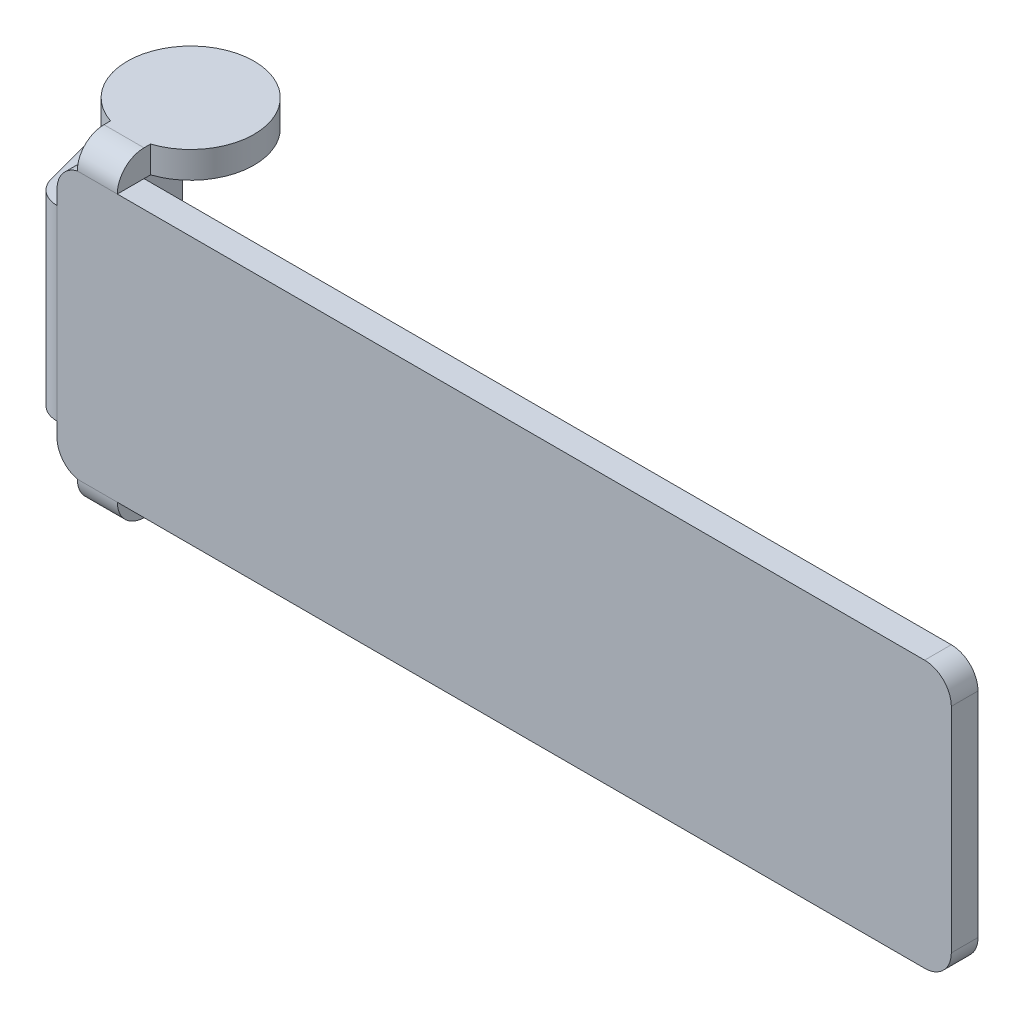
ISO-10303-21;
HEADER;
FILE_DESCRIPTION(('STEP AP214'),'2;1');
FILE_NAME('part.step','',(''),(''),'','','');
FILE_SCHEMA(('AUTOMOTIVE_DESIGN { 1 0 10303 214 1 1 1 1 }'));
ENDSEC;
DATA;
#1=APPLICATION_CONTEXT('core data for automotive mechanical design processes');
#2=APPLICATION_PROTOCOL_DEFINITION('international standard','automotive_design',2000,#1);
#3=PRODUCT_CONTEXT('',#1,'mechanical');
#4=PRODUCT('Part','Part','',(#3));
#5=PRODUCT_RELATED_PRODUCT_CATEGORY('part','',(#4));
#6=PRODUCT_DEFINITION_FORMATION('','',#4);
#7=PRODUCT_DEFINITION_CONTEXT('part definition',#1,'design');
#8=PRODUCT_DEFINITION('design','',#6,#7);
#9=PRODUCT_DEFINITION_SHAPE('','',#8);
#10=(LENGTH_UNIT() NAMED_UNIT(*) SI_UNIT(.MILLI.,.METRE.));
#11=(NAMED_UNIT(*) PLANE_ANGLE_UNIT() SI_UNIT($,.RADIAN.));
#12=(NAMED_UNIT(*) SI_UNIT($,.STERADIAN.) SOLID_ANGLE_UNIT());
#13=UNCERTAINTY_MEASURE_WITH_UNIT(LENGTH_MEASURE(1.E-05),#10,'distance_accuracy_value','');
#14=(GEOMETRIC_REPRESENTATION_CONTEXT(3) GLOBAL_UNCERTAINTY_ASSIGNED_CONTEXT((#13)) GLOBAL_UNIT_ASSIGNED_CONTEXT((#10,
#11,#12)) REPRESENTATION_CONTEXT('',''));
#15=CARTESIAN_POINT('',(0.,0.,0.));
#16=DIRECTION('',(0.,0.,1.));
#17=DIRECTION('',(1.,0.,0.));
#18=AXIS2_PLACEMENT_3D('',#15,#16,#17);
#19=CARTESIAN_POINT('',(3.5,-0.2,0.1));
#20=DIRECTION('',(0.,-1.,0.));
#21=DIRECTION('',(0.,0.,-1.));
#22=AXIS2_PLACEMENT_3D('',#19,#20,#21);
#23=PLANE('',#22);
#24=DIRECTION('',(0.,0.,-1.));
#25=VECTOR('',#24,1.);
#26=CARTESIAN_POINT('',(0.75,-0.2,0.1));
#27=LINE('',#26,#25);
#28=CARTESIAN_POINT('',(0.75,-0.2,-0.0493060905670013));
#29=VERTEX_POINT('',#28);
#30=CARTESIAN_POINT('',(0.75,-0.2,0.));
#31=VERTEX_POINT('',#30);
#32=EDGE_CURVE('E169',#29,#31,#27,.F.);
#33=ORIENTED_EDGE('',*,*,#32,.T.);
#34=DIRECTION('',(1.,0.,0.));
#35=VECTOR('',#34,1.);
#36=CARTESIAN_POINT('',(3.5,-0.2,0.));
#37=LINE('',#36,#35);
#38=CARTESIAN_POINT('',(0.45,-0.2,0.));
#39=VERTEX_POINT('',#38);
#40=EDGE_CURVE('E165',#31,#39,#37,.F.);
#41=ORIENTED_EDGE('',*,*,#40,.T.);
#42=DIRECTION('',(0.,0.,-1.));
#43=VECTOR('',#42,1.);
#44=CARTESIAN_POINT('',(0.45,-0.2,0.1));
#45=LINE('',#44,#43);
#46=CARTESIAN_POINT('',(0.45,-0.2,-0.0493060905670013));
#47=VERTEX_POINT('',#46);
#48=EDGE_CURVE('E163',#39,#47,#45,.T.);
#49=ORIENTED_EDGE('',*,*,#48,.T.);
#50=CARTESIAN_POINT('',(0.6,-0.2,-0.5));
#51=DIRECTION('',(0.,-1.,0.));
#52=DIRECTION('',(0.,0.,-1.));
#53=AXIS2_PLACEMENT_3D('',#50,#51,#52);
#54=CIRCLE('',#53,0.475);
#55=EDGE_CURVE('E20',#29,#47,#54,.F.);
#56=ORIENTED_EDGE('',*,*,#55,.F.);
#57=EDGE_LOOP('',(#33,#41,#49,#56));
#58=FACE_BOUND('',#57,.T.);
#59=ADVANCED_FACE('F17',(#58),#23,.T.);
#60=CARTESIAN_POINT('',(3.5,2.,0.1));
#61=DIRECTION('',(0.,1.,0.));
#62=DIRECTION('',(0.,0.,1.));
#63=AXIS2_PLACEMENT_3D('',#60,#61,#62);
#64=PLANE('',#63);
#65=CARTESIAN_POINT('',(0.6,2.,-0.5));
#66=DIRECTION('',(0.,1.,0.));
#67=DIRECTION('',(0.,0.,1.));
#68=AXIS2_PLACEMENT_3D('',#65,#66,#67);
#69=CIRCLE('',#68,0.475);
#70=CARTESIAN_POINT('',(0.75,2.,-0.0493060905670013));
#71=VERTEX_POINT('',#70);
#72=CARTESIAN_POINT('',(0.45,2.,-0.0493060905670013));
#73=VERTEX_POINT('',#72);
#74=EDGE_CURVE('E258',#71,#73,#69,.T.);
#75=ORIENTED_EDGE('',*,*,#74,.F.);
#76=DIRECTION('',(0.,0.,1.));
#77=VECTOR('',#76,1.);
#78=CARTESIAN_POINT('',(0.75,2.,0.1));
#79=LINE('',#78,#77);
#80=CARTESIAN_POINT('',(0.75,2.,0.));
#81=VERTEX_POINT('',#80);
#82=EDGE_CURVE('E189',#81,#71,#79,.F.);
#83=ORIENTED_EDGE('',*,*,#82,.F.);
#84=DIRECTION('',(1.,0.,0.));
#85=VECTOR('',#84,1.);
#86=CARTESIAN_POINT('',(3.5,2.,0.));
#87=LINE('',#86,#85);
#88=CARTESIAN_POINT('',(0.449999999999585,2.,0.));
#89=VERTEX_POINT('',#88);
#90=EDGE_CURVE('E192',#89,#81,#87,.T.);
#91=ORIENTED_EDGE('',*,*,#90,.F.);
#92=DIRECTION('',(0.,0.,1.));
#93=VECTOR('',#92,1.);
#94=CARTESIAN_POINT('',(0.45,2.,0.1));
#95=LINE('',#94,#93);
#96=EDGE_CURVE('E186',#73,#89,#95,.T.);
#97=ORIENTED_EDGE('',*,*,#96,.F.);
#98=EDGE_LOOP('',(#75,#83,#91,#97));
#99=FACE_BOUND('',#98,.T.);
#100=ADVANCED_FACE('F401',(#99),#64,.F.);
#101=CARTESIAN_POINT('',(0.6,0.,-0.5));
#102=DIRECTION('',(0.,-1.,0.));
#103=DIRECTION('',(0.,0.,-1.));
#104=AXIS2_PLACEMENT_3D('',#101,#102,#103);
#105=CYLINDRICAL_SURFACE('',#104,0.475);
#106=DIRECTION('',(0.,-1.,0.));
#107=VECTOR('',#106,1.);
#108=CARTESIAN_POINT('',(0.45,0.,-0.0493060905670012));
#109=LINE('',#108,#107);
#110=CARTESIAN_POINT('',(0.45,0.,-0.0493060905670012));
#111=VERTEX_POINT('',#110);
#112=EDGE_CURVE('E173',#47,#111,#109,.F.);
#113=ORIENTED_EDGE('',*,*,#112,.T.);
#114=CARTESIAN_POINT('',(0.6,0.,-0.5));
#115=DIRECTION('',(0.,-1.,0.));
#116=DIRECTION('',(0.,0.,-1.));
#117=AXIS2_PLACEMENT_3D('',#114,#115,#116);
#118=CIRCLE('',#117,0.475);
#119=CARTESIAN_POINT('',(0.75,0.,-0.0493060905670013));
#120=VERTEX_POINT('',#119);
#121=EDGE_CURVE('E256',#111,#120,#118,.T.);
#122=ORIENTED_EDGE('',*,*,#121,.T.);
#123=DIRECTION('',(0.,-1.,0.));
#124=VECTOR('',#123,1.);
#125=CARTESIAN_POINT('',(0.75,0.,-0.0493060905670012));
#126=LINE('',#125,#124);
#127=EDGE_CURVE('E157',#120,#29,#126,.T.);
#128=ORIENTED_EDGE('',*,*,#127,.T.);
#129=ORIENTED_EDGE('',*,*,#55,.T.);
#130=EDGE_LOOP('',(#113,#122,#128,#129));
#131=FACE_BOUND('',#130,.T.);
#132=ADVANCED_FACE('F172',(#131),#105,.T.);
#133=CARTESIAN_POINT('',(0.6,2.,-0.5));
#134=DIRECTION('',(0.,1.,0.));
#135=DIRECTION('',(0.,0.,1.));
#136=AXIS2_PLACEMENT_3D('',#133,#134,#135);
#137=CYLINDRICAL_SURFACE('',#136,0.475);
#138=DIRECTION('',(0.,1.,0.));
#139=VECTOR('',#138,1.);
#140=CARTESIAN_POINT('',(0.75,2.,-0.0493060905670012));
#141=LINE('',#140,#139);
#142=CARTESIAN_POINT('',(0.75,2.2,-0.0493060905670013));
#143=VERTEX_POINT('',#142);
#144=EDGE_CURVE('E181',#143,#71,#141,.F.);
#145=ORIENTED_EDGE('',*,*,#144,.T.);
#146=ORIENTED_EDGE('',*,*,#74,.T.);
#147=DIRECTION('',(0.,1.,0.));
#148=VECTOR('',#147,1.);
#149=CARTESIAN_POINT('',(0.45,2.,-0.0493060905670012));
#150=LINE('',#149,#148);
#151=CARTESIAN_POINT('',(0.45,2.2,-0.0493060905670013));
#152=VERTEX_POINT('',#151);
#153=EDGE_CURVE('E179',#73,#152,#150,.T.);
#154=ORIENTED_EDGE('',*,*,#153,.T.);
#155=CARTESIAN_POINT('',(0.6,2.2,-0.5));
#156=DIRECTION('',(0.,1.,0.));
#157=DIRECTION('',(0.,0.,1.));
#158=AXIS2_PLACEMENT_3D('',#155,#156,#157);
#159=CIRCLE('',#158,0.475);
#160=EDGE_CURVE('E248',#143,#152,#159,.T.);
#161=ORIENTED_EDGE('',*,*,#160,.F.);
#162=EDGE_LOOP('',(#145,#146,#154,#161));
#163=FACE_BOUND('',#162,.T.);
#164=ADVANCED_FACE('F524',(#163),#137,.T.);
#165=CARTESIAN_POINT('',(3.5,0.,0.1));
#166=DIRECTION('',(0.,-1.,0.));
#167=DIRECTION('',(0.,0.,-1.));
#168=AXIS2_PLACEMENT_3D('',#165,#166,#167);
#169=PLANE('',#168);
#170=ORIENTED_EDGE('',*,*,#121,.F.);
#171=DIRECTION('',(0.,0.,1.));
#172=VECTOR('',#171,1.);
#173=CARTESIAN_POINT('',(0.45,0.,0.2));
#174=LINE('',#173,#172);
#175=CARTESIAN_POINT('',(0.44999999999999,0.,0.));
#176=VERTEX_POINT('',#175);
#177=EDGE_CURVE('E178',#176,#111,#174,.F.);
#178=ORIENTED_EDGE('',*,*,#177,.F.);
#179=DIRECTION('',(1.,0.,0.));
#180=VECTOR('',#179,1.);
#181=CARTESIAN_POINT('',(3.5,0.,0.));
#182=LINE('',#181,#180);
#183=CARTESIAN_POINT('',(0.75,0.,0.));
#184=VERTEX_POINT('',#183);
#185=EDGE_CURVE('E257',#184,#176,#182,.F.);
#186=ORIENTED_EDGE('',*,*,#185,.F.);
#187=DIRECTION('',(0.,0.,-1.));
#188=VECTOR('',#187,1.);
#189=CARTESIAN_POINT('',(0.75,0.,-0.049306090567));
#190=LINE('',#189,#188);
#191=EDGE_CURVE('E245',#120,#184,#190,.F.);
#192=ORIENTED_EDGE('',*,*,#191,.F.);
#193=EDGE_LOOP('',(#170,#178,#186,#192));
#194=FACE_BOUND('',#193,.T.);
#195=ADVANCED_FACE('F429',(#194),#169,.F.);
#196=CARTESIAN_POINT('',(1.226449574399,0.,0.));
#197=DIRECTION('',(-1.,0.,0.));
#198=DIRECTION('',(0.,0.,1.));
#199=AXIS2_PLACEMENT_3D('',#196,#197,#198);
#200=CYLINDRICAL_SURFACE('',#199,0.2);
#201=DIRECTION('',(1.,0.,0.));
#202=VECTOR('',#201,1.);
#203=CARTESIAN_POINT('',(0.,0.,0.2));
#204=LINE('',#203,#202);
#205=CARTESIAN_POINT('',(0.44999999999999,0.,0.2));
#206=VERTEX_POINT('',#205);
#207=CARTESIAN_POINT('',(0.75,0.,0.2));
#208=VERTEX_POINT('',#207);
#209=EDGE_CURVE('E244',#206,#208,#204,.T.);
#210=ORIENTED_EDGE('',*,*,#209,.F.);
#211=CARTESIAN_POINT('',(0.45,0.,0.));
#212=DIRECTION('',(-1.,0.,0.));
#213=DIRECTION('',(0.,0.,1.));
#214=AXIS2_PLACEMENT_3D('',#211,#212,#213);
#215=CIRCLE('',#214,0.2);
#216=EDGE_CURVE('E246',#39,#206,#215,.T.);
#217=ORIENTED_EDGE('',*,*,#216,.F.);
#218=ORIENTED_EDGE('',*,*,#40,.F.);
#219=CARTESIAN_POINT('',(0.75,0.,0.));
#220=DIRECTION('',(-1.,0.,0.));
#221=DIRECTION('',(0.,0.,1.));
#222=AXIS2_PLACEMENT_3D('',#219,#220,#221);
#223=CIRCLE('',#222,0.2);
#224=EDGE_CURVE('E241',#208,#31,#223,.F.);
#225=ORIENTED_EDGE('',*,*,#224,.F.);
#226=EDGE_LOOP('',(#210,#217,#218,#225));
#227=FACE_BOUND('',#226,.T.);
#228=ADVANCED_FACE('F517',(#227),#200,.T.);
#229=CARTESIAN_POINT('',(0.2980323340741,1.833704,0.));
#230=DIRECTION('',(0.,-1.,0.));
#231=DIRECTION('',(0.,0.,-1.));
#232=AXIS2_PLACEMENT_3D('',#229,#230,#231);
#233=CYLINDRICAL_SURFACE('',#232,0.2);
#234=DIRECTION('',(0.,1.,0.));
#235=VECTOR('',#234,1.);
#236=CARTESIAN_POINT('',(0.104847168816376,0.,0.0517638090204795));
#237=LINE('',#236,#235);
#238=CARTESIAN_POINT('',(0.104847168816337,0.3,0.051763809020485));
#239=VERTEX_POINT('',#238);
#240=CARTESIAN_POINT('',(0.104847168816337,1.7,0.051763809020485));
#241=VERTEX_POINT('',#240);
#242=EDGE_CURVE('E276',#239,#241,#237,.T.);
#243=ORIENTED_EDGE('',*,*,#242,.F.);
#244=CARTESIAN_POINT('',(0.2980323340741,0.3,0.));
#245=DIRECTION('',(0.,-1.,0.));
#246=DIRECTION('',(0.,0.,-1.));
#247=AXIS2_PLACEMENT_3D('',#244,#245,#246);
#248=CIRCLE('',#247,0.2);
#249=CARTESIAN_POINT('',(0.2980323340741,0.3,0.2));
#250=VERTEX_POINT('',#249);
#251=EDGE_CURVE('E252',#239,#250,#248,.F.);
#252=ORIENTED_EDGE('',*,*,#251,.T.);
#253=DIRECTION('',(0.,1.,0.));
#254=VECTOR('',#253,1.);
#255=CARTESIAN_POINT('',(0.2980323340741,0.,0.2));
#256=LINE('',#255,#254);
#257=CARTESIAN_POINT('',(0.2980323340741,1.7,0.2));
#258=VERTEX_POINT('',#257);
#259=EDGE_CURVE('E268',#258,#250,#256,.F.);
#260=ORIENTED_EDGE('',*,*,#259,.F.);
#261=CARTESIAN_POINT('',(0.2980323340741,1.7,0.));
#262=DIRECTION('',(0.,-1.,0.));
#263=DIRECTION('',(0.,0.,-1.));
#264=AXIS2_PLACEMENT_3D('',#261,#262,#263);
#265=CIRCLE('',#264,0.2);
#266=EDGE_CURVE('E254',#258,#241,#265,.T.);
#267=ORIENTED_EDGE('',*,*,#266,.T.);
#268=EDGE_LOOP('',(#243,#252,#260,#267));
#269=FACE_BOUND('',#268,.T.);
#270=ADVANCED_FACE('F447',(#269),#233,.T.);
#271=CARTESIAN_POINT('',(3.5,2.2,0.1));
#272=DIRECTION('',(0.,1.,0.));
#273=DIRECTION('',(0.,0.,1.));
#274=AXIS2_PLACEMENT_3D('',#271,#272,#273);
#275=PLANE('',#274);
#276=DIRECTION('',(0.,0.,1.));
#277=VECTOR('',#276,1.);
#278=CARTESIAN_POINT('',(0.45,2.2,0.1));
#279=LINE('',#278,#277);
#280=CARTESIAN_POINT('',(0.45,2.2,0.));
#281=VERTEX_POINT('',#280);
#282=EDGE_CURVE('E251',#152,#281,#279,.T.);
#283=ORIENTED_EDGE('',*,*,#282,.T.);
#284=DIRECTION('',(1.,0.,0.));
#285=VECTOR('',#284,1.);
#286=CARTESIAN_POINT('',(-0.02644957439943,2.2,0.));
#287=LINE('',#286,#285);
#288=CARTESIAN_POINT('',(0.75,2.2,0.));
#289=VERTEX_POINT('',#288);
#290=EDGE_CURVE('E273',#289,#281,#287,.F.);
#291=ORIENTED_EDGE('',*,*,#290,.F.);
#292=DIRECTION('',(0.,0.,-1.));
#293=VECTOR('',#292,1.);
#294=CARTESIAN_POINT('',(0.75,2.2,0.2));
#295=LINE('',#294,#293);
#296=EDGE_CURVE('E236',#143,#289,#295,.F.);
#297=ORIENTED_EDGE('',*,*,#296,.F.);
#298=ORIENTED_EDGE('',*,*,#160,.T.);
#299=EDGE_LOOP('',(#283,#291,#297,#298));
#300=FACE_BOUND('',#299,.T.);
#301=ADVANCED_FACE('F469',(#300),#275,.T.);
#302=CARTESIAN_POINT('',(-0.02644957439943,2.,0.));
#303=DIRECTION('',(1.,0.,0.));
#304=DIRECTION('',(0.,0.,-1.));
#305=AXIS2_PLACEMENT_3D('',#302,#303,#304);
#306=CYLINDRICAL_SURFACE('',#305,0.2);
#307=CARTESIAN_POINT('',(0.45,2.,0.));
#308=DIRECTION('',(1.,0.,0.));
#309=DIRECTION('',(0.,0.,-1.));
#310=AXIS2_PLACEMENT_3D('',#307,#308,#309);
#311=CIRCLE('',#310,0.2);
#312=CARTESIAN_POINT('',(0.449999999999585,2.0000000000001,0.2));
#313=VERTEX_POINT('',#312);
#314=EDGE_CURVE('E230',#313,#281,#311,.F.);
#315=ORIENTED_EDGE('',*,*,#314,.F.);
#316=DIRECTION('',(1.,0.,0.));
#317=VECTOR('',#316,1.);
#318=CARTESIAN_POINT('',(0.,2.,0.2));
#319=LINE('',#318,#317);
#320=CARTESIAN_POINT('',(0.75,2.,0.2));
#321=VERTEX_POINT('',#320);
#322=EDGE_CURVE('E240',#321,#313,#319,.F.);
#323=ORIENTED_EDGE('',*,*,#322,.F.);
#324=CARTESIAN_POINT('',(0.75,2.,0.));
#325=DIRECTION('',(1.,0.,0.));
#326=DIRECTION('',(0.,0.,-1.));
#327=AXIS2_PLACEMENT_3D('',#324,#325,#326);
#328=CIRCLE('',#327,0.2);
#329=EDGE_CURVE('E234',#289,#321,#328,.T.);
#330=ORIENTED_EDGE('',*,*,#329,.F.);
#331=ORIENTED_EDGE('',*,*,#290,.T.);
#332=EDGE_LOOP('',(#315,#323,#330,#331));
#333=FACE_BOUND('',#332,.T.);
#334=ADVANCED_FACE('F460',(#333),#306,.T.);
#335=CARTESIAN_POINT('',(0.1445669364784,0.,0.2));
#336=DIRECTION('',(-0.965925826289076,0.,0.258819045102493));
#337=DIRECTION('',(0.258819045102493,0.,0.965925826289076));
#338=AXIS2_PLACEMENT_3D('',#335,#336,#337);
#339=PLANE('',#338);
#340=DIRECTION('',(-0.25881904510247,0.,-0.965925826289082));
#341=VECTOR('',#340,1.);
#342=CARTESIAN_POINT('',(0.1048471688163,0.3,0.0517638090205));
#343=LINE('',#342,#341);
#344=CARTESIAN_POINT('',(-0.1657420132248,0.3,-0.9580887663356));
#345=VERTEX_POINT('',#344);
#346=EDGE_CURVE('E304',#239,#345,#343,.T.);
#347=ORIENTED_EDGE('',*,*,#346,.F.);
#348=ORIENTED_EDGE('',*,*,#242,.T.);
#349=DIRECTION('',(-0.25881904510247,0.,-0.965925826289082));
#350=VECTOR('',#349,1.);
#351=CARTESIAN_POINT('',(0.1048471688163,1.7,0.0517638090205));
#352=LINE('',#351,#350);
#353=CARTESIAN_POINT('',(-0.1657420132248,1.7,-0.9580887663356));
#354=VERTEX_POINT('',#353);
#355=EDGE_CURVE('E282',#241,#354,#352,.T.);
#356=ORIENTED_EDGE('',*,*,#355,.T.);
#357=DIRECTION('',(0.,1.,0.));
#358=VECTOR('',#357,1.);
#359=CARTESIAN_POINT('',(-0.1657420132248,0.,-0.9580887663356));
#360=LINE('',#359,#358);
#361=EDGE_CURVE('E233',#345,#354,#360,.T.);
#362=ORIENTED_EDGE('',*,*,#361,.F.);
#363=EDGE_LOOP('',(#347,#348,#356,#362));
#364=FACE_BOUND('',#363,.T.);
#365=ADVANCED_FACE('F458',(#364),#339,.T.);
#366=CARTESIAN_POINT('',(0.45,0.,0.2));
#367=DIRECTION('',(-1.,0.,0.));
#368=DIRECTION('',(0.,0.,1.));
#369=AXIS2_PLACEMENT_3D('',#366,#367,#368);
#370=PLANE('',#369);
#371=ORIENTED_EDGE('',*,*,#216,.T.);
#372=DIRECTION('',(0.,0.,-1.));
#373=VECTOR('',#372,1.);
#374=CARTESIAN_POINT('',(0.449999999999999,0.,0.2019869));
#375=LINE('',#374,#373);
#376=EDGE_CURVE('E229',#176,#206,#375,.F.);
#377=ORIENTED_EDGE('',*,*,#376,.F.);
#378=ORIENTED_EDGE('',*,*,#177,.T.);
#379=ORIENTED_EDGE('',*,*,#112,.F.);
#380=ORIENTED_EDGE('',*,*,#48,.F.);
#381=EDGE_LOOP('',(#371,#377,#378,#379,#380));
#382=FACE_BOUND('',#381,.T.);
#383=ADVANCED_FACE('F175',(#382),#370,.T.);
#384=CARTESIAN_POINT('',(0.75,0.,-0.049306090567));
#385=DIRECTION('',(1.,0.,0.));
#386=DIRECTION('',(0.,0.,-1.));
#387=AXIS2_PLACEMENT_3D('',#384,#385,#386);
#388=PLANE('',#387);
#389=DIRECTION('',(0.,0.,-1.));
#390=VECTOR('',#389,1.);
#391=CARTESIAN_POINT('',(0.75,0.,0.));
#392=LINE('',#391,#390);
#393=EDGE_CURVE('E224',#208,#184,#392,.T.);
#394=ORIENTED_EDGE('',*,*,#393,.F.);
#395=ORIENTED_EDGE('',*,*,#224,.T.);
#396=ORIENTED_EDGE('',*,*,#32,.F.);
#397=ORIENTED_EDGE('',*,*,#127,.F.);
#398=ORIENTED_EDGE('',*,*,#191,.T.);
#399=EDGE_LOOP('',(#394,#395,#396,#397,#398));
#400=FACE_BOUND('',#399,.T.);
#401=ADVANCED_FACE('F467',(#400),#388,.T.);
#402=CARTESIAN_POINT('',(0.,0.,0.2));
#403=DIRECTION('',(0.,0.,1.));
#404=DIRECTION('',(1.,0.,0.));
#405=AXIS2_PLACEMENT_3D('',#402,#403,#404);
#406=PLANE('',#405);
#407=DIRECTION('',(0.,1.,0.));
#408=VECTOR('',#407,1.);
#409=CARTESIAN_POINT('',(0.2980323340741,0.,0.2));
#410=LINE('',#409,#408);
#411=CARTESIAN_POINT('',(0.2980323340741,0.1941465809212,0.2));
#412=VERTEX_POINT('',#411);
#413=EDGE_CURVE('E271',#250,#412,#410,.F.);
#414=ORIENTED_EDGE('',*,*,#413,.T.);
#415=CARTESIAN_POINT('',(0.4980323340741,0.1941465809212,0.2));
#416=DIRECTION('',(0.,0.,-1.));
#417=DIRECTION('',(-1.,0.,0.));
#418=AXIS2_PLACEMENT_3D('',#415,#416,#417);
#419=CIRCLE('',#418,0.2);
#420=EDGE_CURVE('E225',#206,#412,#419,.T.);
#421=ORIENTED_EDGE('',*,*,#420,.F.);
#422=ORIENTED_EDGE('',*,*,#209,.T.);
#423=DIRECTION('',(1.,0.,0.));
#424=VECTOR('',#423,1.);
#425=CARTESIAN_POINT('',(0.,0.,0.2));
#426=LINE('',#425,#424);
#427=CARTESIAN_POINT('',(6.8,0.,0.2));
#428=VERTEX_POINT('',#427);
#429=EDGE_CURVE('E228',#428,#208,#426,.F.);
#430=ORIENTED_EDGE('',*,*,#429,.F.);
#431=CARTESIAN_POINT('',(6.8,0.2,0.2));
#432=DIRECTION('',(0.,0.,-1.));
#433=DIRECTION('',(-1.,0.,0.));
#434=AXIS2_PLACEMENT_3D('',#431,#432,#433);
#435=CIRCLE('',#434,0.2);
#436=CARTESIAN_POINT('',(7.,0.2,0.2));
#437=VERTEX_POINT('',#436);
#438=EDGE_CURVE('E221',#437,#428,#435,.T.);
#439=ORIENTED_EDGE('',*,*,#438,.F.);
#440=DIRECTION('',(0.,1.,0.));
#441=VECTOR('',#440,1.);
#442=CARTESIAN_POINT('',(7.,0.,0.2));
#443=LINE('',#442,#441);
#444=CARTESIAN_POINT('',(7.,1.8,0.2));
#445=VERTEX_POINT('',#444);
#446=EDGE_CURVE('E290',#445,#437,#443,.F.);
#447=ORIENTED_EDGE('',*,*,#446,.F.);
#448=CARTESIAN_POINT('',(6.8,1.8,0.2));
#449=DIRECTION('',(0.,0.,-1.));
#450=DIRECTION('',(-1.,0.,0.));
#451=AXIS2_PLACEMENT_3D('',#448,#449,#450);
#452=CIRCLE('',#451,0.2);
#453=CARTESIAN_POINT('',(6.8,2.,0.2));
#454=VERTEX_POINT('',#453);
#455=EDGE_CURVE('E217',#454,#445,#452,.T.);
#456=ORIENTED_EDGE('',*,*,#455,.F.);
#457=DIRECTION('',(1.,0.,0.));
#458=VECTOR('',#457,1.);
#459=CARTESIAN_POINT('',(7.,2.,0.2));
#460=LINE('',#459,#458);
#461=EDGE_CURVE('E296',#321,#454,#460,.T.);
#462=ORIENTED_EDGE('',*,*,#461,.F.);
#463=ORIENTED_EDGE('',*,*,#322,.T.);
#464=CARTESIAN_POINT('',(0.4980323340741,1.805853419079,0.2));
#465=DIRECTION('',(0.,0.,1.));
#466=DIRECTION('',(1.,0.,0.));
#467=AXIS2_PLACEMENT_3D('',#464,#465,#466);
#468=CIRCLE('',#467,0.2);
#469=CARTESIAN_POINT('',(0.2980323340741,1.805853419079,0.2));
#470=VERTEX_POINT('',#469);
#471=EDGE_CURVE('E237',#313,#470,#468,.T.);
#472=ORIENTED_EDGE('',*,*,#471,.T.);
#473=DIRECTION('',(0.,1.,0.));
#474=VECTOR('',#473,1.);
#475=CARTESIAN_POINT('',(0.2980323340741,0.,0.2));
#476=LINE('',#475,#474);
#477=EDGE_CURVE('E239',#470,#258,#476,.F.);
#478=ORIENTED_EDGE('',*,*,#477,.T.);
#479=ORIENTED_EDGE('',*,*,#259,.T.);
#480=EDGE_LOOP('',(#414,#421,#422,#430,#439,#447,#456,#462,#463,#472,#478,#479));
#481=FACE_BOUND('',#480,.T.);
#482=ADVANCED_FACE('F449',(#481),#406,.T.);
#483=CARTESIAN_POINT('',(0.75,2.,0.2));
#484=DIRECTION('',(1.,0.,0.));
#485=DIRECTION('',(0.,0.,-1.));
#486=AXIS2_PLACEMENT_3D('',#483,#484,#485);
#487=PLANE('',#486);
#488=ORIENTED_EDGE('',*,*,#296,.T.);
#489=ORIENTED_EDGE('',*,*,#329,.T.);
#490=DIRECTION('',(0.,0.,1.));
#491=VECTOR('',#490,1.);
#492=CARTESIAN_POINT('',(0.75,2.,0.));
#493=LINE('',#492,#491);
#494=EDGE_CURVE('E334',#81,#321,#493,.T.);
#495=ORIENTED_EDGE('',*,*,#494,.F.);
#496=ORIENTED_EDGE('',*,*,#82,.T.);
#497=ORIENTED_EDGE('',*,*,#144,.F.);
#498=EDGE_LOOP('',(#488,#489,#495,#496,#497));
#499=FACE_BOUND('',#498,.T.);
#500=ADVANCED_FACE('F506',(#499),#487,.T.);
#501=CARTESIAN_POINT('',(0.45,2.,-0.049306090567));
#502=DIRECTION('',(-1.,0.,0.));
#503=DIRECTION('',(0.,0.,1.));
#504=AXIS2_PLACEMENT_3D('',#501,#502,#503);
#505=PLANE('',#504);
#506=ORIENTED_EDGE('',*,*,#96,.T.);
#507=DIRECTION('',(0.,0.,1.));
#508=VECTOR('',#507,1.);
#509=CARTESIAN_POINT('',(0.449999999999952,2.00000000000019,-0.0020131));
#510=LINE('',#509,#508);
#511=EDGE_CURVE('E337',#313,#89,#510,.F.);
#512=ORIENTED_EDGE('',*,*,#511,.F.);
#513=ORIENTED_EDGE('',*,*,#314,.T.);
#514=ORIENTED_EDGE('',*,*,#282,.F.);
#515=ORIENTED_EDGE('',*,*,#153,.F.);
#516=EDGE_LOOP('',(#506,#512,#513,#514,#515));
#517=FACE_BOUND('',#516,.T.);
#518=ADVANCED_FACE('F398',(#517),#505,.T.);
#519=CARTESIAN_POINT('',(-0.1657420132248,0.,-0.9580887663356));
#520=DIRECTION('',(-0.258819045102493,0.,-0.965925826289076));
#521=DIRECTION('',(-0.965925826289076,0.,0.258819045102493));
#522=AXIS2_PLACEMENT_3D('',#519,#520,#521);
#523=PLANE('',#522);
#524=DIRECTION('',(0.,1.,0.));
#525=VECTOR('',#524,1.);
#526=CARTESIAN_POINT('',(0.027443152033,0.,-1.009852575356));
#527=LINE('',#526,#525);
#528=CARTESIAN_POINT('',(0.0274431520330001,0.3,-1.009852575356));
#529=VERTEX_POINT('',#528);
#530=CARTESIAN_POINT('',(0.027443152033,1.7,-1.009852575356));
#531=VERTEX_POINT('',#530);
#532=EDGE_CURVE('E307',#529,#531,#527,.T.);
#533=ORIENTED_EDGE('',*,*,#532,.F.);
#534=DIRECTION('',(0.965925826289194,0.,-0.258819045102051));
#535=VECTOR('',#534,1.);
#536=CARTESIAN_POINT('',(-0.1657420132248,0.3,-0.9580887663356));
#537=LINE('',#536,#535);
#538=EDGE_CURVE('E302',#345,#529,#537,.T.);
#539=ORIENTED_EDGE('',*,*,#538,.F.);
#540=ORIENTED_EDGE('',*,*,#361,.T.);
#541=DIRECTION('',(0.965925826289194,0.,-0.258819045102051));
#542=VECTOR('',#541,1.);
#543=CARTESIAN_POINT('',(-0.1657420132248,1.7,-0.9580887663356));
#544=LINE('',#543,#542);
#545=EDGE_CURVE('E313',#354,#531,#544,.T.);
#546=ORIENTED_EDGE('',*,*,#545,.T.);
#547=EDGE_LOOP('',(#533,#539,#540,#546));
#548=FACE_BOUND('',#547,.T.);
#549=ADVANCED_FACE('F456',(#548),#523,.T.);
#550=CARTESIAN_POINT('',(3.5,1.7,0.1));
#551=DIRECTION('',(0.,-1.,0.));
#552=DIRECTION('',(0.,0.,-1.));
#553=AXIS2_PLACEMENT_3D('',#550,#551,#552);
#554=PLANE('',#553);
#555=DIRECTION('',(-0.258819045102493,0.,-0.965925826289076));
#556=VECTOR('',#555,1.);
#557=CARTESIAN_POINT('',(0.027443152033,1.7,-1.009852575356));
#558=LINE('',#557,#556);
#559=CARTESIAN_POINT('',(0.2980323340741,1.7,0.));
#560=VERTEX_POINT('',#559);
#561=EDGE_CURVE('E309',#531,#560,#558,.F.);
#562=ORIENTED_EDGE('',*,*,#561,.F.);
#563=ORIENTED_EDGE('',*,*,#545,.F.);
#564=ORIENTED_EDGE('',*,*,#355,.F.);
#565=ORIENTED_EDGE('',*,*,#266,.F.);
#566=DIRECTION('',(0.,0.,-1.));
#567=VECTOR('',#566,1.);
#568=CARTESIAN_POINT('',(0.2980323340741,1.7,0.2));
#569=LINE('',#568,#567);
#570=EDGE_CURVE('E344',#258,#560,#569,.T.);
#571=ORIENTED_EDGE('',*,*,#570,.T.);
#572=EDGE_LOOP('',(#562,#563,#564,#565,#571));
#573=FACE_BOUND('',#572,.T.);
#574=ADVANCED_FACE('F442',(#573),#554,.F.);
#575=CARTESIAN_POINT('',(3.5,0.3,0.1));
#576=DIRECTION('',(0.,-1.,0.));
#577=DIRECTION('',(0.,0.,-1.));
#578=AXIS2_PLACEMENT_3D('',#575,#576,#577);
#579=PLANE('',#578);
#580=DIRECTION('',(0.,0.,-1.));
#581=VECTOR('',#580,1.);
#582=CARTESIAN_POINT('',(0.2980323340741,0.3,0.));
#583=LINE('',#582,#581);
#584=CARTESIAN_POINT('',(0.2980323340741,0.3,0.));
#585=VERTEX_POINT('',#584);
#586=EDGE_CURVE('E34',#585,#250,#583,.F.);
#587=ORIENTED_EDGE('',*,*,#586,.T.);
#588=ORIENTED_EDGE('',*,*,#251,.F.);
#589=ORIENTED_EDGE('',*,*,#346,.T.);
#590=ORIENTED_EDGE('',*,*,#538,.T.);
#591=DIRECTION('',(-0.258819045102493,0.,-0.965925826289076));
#592=VECTOR('',#591,1.);
#593=CARTESIAN_POINT('',(0.027443152033,0.3,-1.009852575356));
#594=LINE('',#593,#592);
#595=EDGE_CURVE('E310',#585,#529,#594,.T.);
#596=ORIENTED_EDGE('',*,*,#595,.F.);
#597=EDGE_LOOP('',(#587,#588,#589,#590,#596));
#598=FACE_BOUND('',#597,.T.);
#599=ADVANCED_FACE('F451',(#598),#579,.T.);
#600=CARTESIAN_POINT('',(0.4980323340741,0.1941465809212,0.2019869));
#601=DIRECTION('',(0.,0.,-1.));
#602=DIRECTION('',(-1.,0.,0.));
#603=AXIS2_PLACEMENT_3D('',#600,#601,#602);
#604=CYLINDRICAL_SURFACE('',#603,0.2);
#605=DIRECTION('',(0.,0.,-1.));
#606=VECTOR('',#605,1.);
#607=CARTESIAN_POINT('',(0.2980323340741,0.1941465809212,0.));
#608=LINE('',#607,#606);
#609=CARTESIAN_POINT('',(0.2980323340741,0.1941465809212,0.));
#610=VERTEX_POINT('',#609);
#611=EDGE_CURVE('E352',#412,#610,#608,.T.);
#612=ORIENTED_EDGE('',*,*,#611,.T.);
#613=CARTESIAN_POINT('',(0.4980323340741,0.1941465809212,0.));
#614=DIRECTION('',(0.,0.,-1.));
#615=DIRECTION('',(-1.,0.,0.));
#616=AXIS2_PLACEMENT_3D('',#613,#614,#615);
#617=CIRCLE('',#616,0.2);
#618=EDGE_CURVE('E214',#610,#176,#617,.F.);
#619=ORIENTED_EDGE('',*,*,#618,.T.);
#620=ORIENTED_EDGE('',*,*,#376,.T.);
#621=ORIENTED_EDGE('',*,*,#420,.T.);
#622=EDGE_LOOP('',(#612,#619,#620,#621));
#623=FACE_BOUND('',#622,.T.);
#624=ADVANCED_FACE('F432',(#623),#604,.T.);
#625=CARTESIAN_POINT('',(0.,0.,0.));
#626=DIRECTION('',(0.,-1.,0.));
#627=DIRECTION('',(0.,0.,-1.));
#628=AXIS2_PLACEMENT_3D('',#625,#626,#627);
#629=PLANE('',#628);
#630=ORIENTED_EDGE('',*,*,#429,.T.);
#631=ORIENTED_EDGE('',*,*,#393,.T.);
#632=DIRECTION('',(1.,0.,0.));
#633=VECTOR('',#632,1.);
#634=CARTESIAN_POINT('',(0.,0.,0.));
#635=LINE('',#634,#633);
#636=CARTESIAN_POINT('',(6.8,0.,0.));
#637=VERTEX_POINT('',#636);
#638=EDGE_CURVE('E213',#184,#637,#635,.T.);
#639=ORIENTED_EDGE('',*,*,#638,.T.);
#640=DIRECTION('',(0.,0.,-1.));
#641=VECTOR('',#640,1.);
#642=CARTESIAN_POINT('',(6.8,0.,0.35648));
#643=LINE('',#642,#641);
#644=EDGE_CURVE('E223',#428,#637,#643,.T.);
#645=ORIENTED_EDGE('',*,*,#644,.F.);
#646=EDGE_LOOP('',(#630,#631,#639,#645));
#647=FACE_BOUND('',#646,.T.);
#648=ADVANCED_FACE('F424',(#647),#629,.T.);
#649=CARTESIAN_POINT('',(6.8,0.2,0.35648));
#650=DIRECTION('',(0.,0.,-1.));
#651=DIRECTION('',(-1.,0.,0.));
#652=AXIS2_PLACEMENT_3D('',#649,#650,#651);
#653=CYLINDRICAL_SURFACE('',#652,0.2);
#654=ORIENTED_EDGE('',*,*,#644,.T.);
#655=CARTESIAN_POINT('',(6.8,0.2,0.));
#656=DIRECTION('',(0.,0.,-1.));
#657=DIRECTION('',(-1.,0.,0.));
#658=AXIS2_PLACEMENT_3D('',#655,#656,#657);
#659=CIRCLE('',#658,0.2);
#660=CARTESIAN_POINT('',(7.,0.2,0.));
#661=VERTEX_POINT('',#660);
#662=EDGE_CURVE('E210',#637,#661,#659,.F.);
#663=ORIENTED_EDGE('',*,*,#662,.T.);
#664=DIRECTION('',(0.,0.,-1.));
#665=VECTOR('',#664,1.);
#666=CARTESIAN_POINT('',(7.,0.2,0.));
#667=LINE('',#666,#665);
#668=EDGE_CURVE('E220',#437,#661,#667,.T.);
#669=ORIENTED_EDGE('',*,*,#668,.F.);
#670=ORIENTED_EDGE('',*,*,#438,.T.);
#671=EDGE_LOOP('',(#654,#663,#669,#670));
#672=FACE_BOUND('',#671,.T.);
#673=ADVANCED_FACE('F420',(#672),#653,.T.);
#674=CARTESIAN_POINT('',(7.,0.,0.));
#675=DIRECTION('',(1.,0.,0.));
#676=DIRECTION('',(0.,0.,-1.));
#677=AXIS2_PLACEMENT_3D('',#674,#675,#676);
#678=PLANE('',#677);
#679=DIRECTION('',(0.,1.,0.));
#680=VECTOR('',#679,1.);
#681=CARTESIAN_POINT('',(7.,0.,0.));
#682=LINE('',#681,#680);
#683=CARTESIAN_POINT('',(7.,1.8,0.));
#684=VERTEX_POINT('',#683);
#685=EDGE_CURVE('E209',#661,#684,#682,.T.);
#686=ORIENTED_EDGE('',*,*,#685,.T.);
#687=DIRECTION('',(0.,0.,-1.));
#688=VECTOR('',#687,1.);
#689=CARTESIAN_POINT('',(7.,1.8,0.35648));
#690=LINE('',#689,#688);
#691=EDGE_CURVE('E219',#445,#684,#690,.T.);
#692=ORIENTED_EDGE('',*,*,#691,.F.);
#693=ORIENTED_EDGE('',*,*,#446,.T.);
#694=ORIENTED_EDGE('',*,*,#668,.T.);
#695=EDGE_LOOP('',(#686,#692,#693,#694));
#696=FACE_BOUND('',#695,.T.);
#697=ADVANCED_FACE('F414',(#696),#678,.T.);
#698=CARTESIAN_POINT('',(6.8,1.8,0.35648));
#699=DIRECTION('',(0.,0.,-1.));
#700=DIRECTION('',(-1.,0.,0.));
#701=AXIS2_PLACEMENT_3D('',#698,#699,#700);
#702=CYLINDRICAL_SURFACE('',#701,0.2);
#703=ORIENTED_EDGE('',*,*,#691,.T.);
#704=CARTESIAN_POINT('',(6.8,1.8,0.));
#705=DIRECTION('',(0.,0.,-1.));
#706=DIRECTION('',(-1.,0.,0.));
#707=AXIS2_PLACEMENT_3D('',#704,#705,#706);
#708=CIRCLE('',#707,0.2);
#709=CARTESIAN_POINT('',(6.8,2.,0.));
#710=VERTEX_POINT('',#709);
#711=EDGE_CURVE('E206',#684,#710,#708,.F.);
#712=ORIENTED_EDGE('',*,*,#711,.T.);
#713=DIRECTION('',(0.,0.,1.));
#714=VECTOR('',#713,1.);
#715=CARTESIAN_POINT('',(6.8,2.,0.));
#716=LINE('',#715,#714);
#717=EDGE_CURVE('E298',#454,#710,#716,.F.);
#718=ORIENTED_EDGE('',*,*,#717,.F.);
#719=ORIENTED_EDGE('',*,*,#455,.T.);
#720=EDGE_LOOP('',(#703,#712,#718,#719));
#721=FACE_BOUND('',#720,.T.);
#722=ADVANCED_FACE('F409',(#721),#702,.T.);
#723=CARTESIAN_POINT('',(7.,2.,0.));
#724=DIRECTION('',(0.,1.,0.));
#725=DIRECTION('',(0.,0.,1.));
#726=AXIS2_PLACEMENT_3D('',#723,#724,#725);
#727=PLANE('',#726);
#728=DIRECTION('',(1.,0.,0.));
#729=VECTOR('',#728,1.);
#730=CARTESIAN_POINT('',(0.,2.,0.));
#731=LINE('',#730,#729);
#732=EDGE_CURVE('E205',#710,#81,#731,.F.);
#733=ORIENTED_EDGE('',*,*,#732,.T.);
#734=ORIENTED_EDGE('',*,*,#494,.T.);
#735=ORIENTED_EDGE('',*,*,#461,.T.);
#736=ORIENTED_EDGE('',*,*,#717,.T.);
#737=EDGE_LOOP('',(#733,#734,#735,#736));
#738=FACE_BOUND('',#737,.T.);
#739=ADVANCED_FACE('F485',(#738),#727,.T.);
#740=CARTESIAN_POINT('',(0.4980323340741,1.805853419079,-0.0020131));
#741=DIRECTION('',(0.,0.,1.));
#742=DIRECTION('',(1.,0.,0.));
#743=AXIS2_PLACEMENT_3D('',#740,#741,#742);
#744=CYLINDRICAL_SURFACE('',#743,0.2);
#745=DIRECTION('',(0.,0.,-1.));
#746=VECTOR('',#745,1.);
#747=CARTESIAN_POINT('',(0.2980323340741,1.805853419079,0.2));
#748=LINE('',#747,#746);
#749=CARTESIAN_POINT('',(0.2980323340741,1.805853419079,0.));
#750=VERTEX_POINT('',#749);
#751=EDGE_CURVE('E341',#750,#470,#748,.F.);
#752=ORIENTED_EDGE('',*,*,#751,.T.);
#753=ORIENTED_EDGE('',*,*,#471,.F.);
#754=ORIENTED_EDGE('',*,*,#511,.T.);
#755=CARTESIAN_POINT('',(0.4980323340741,1.805853419079,0.));
#756=DIRECTION('',(0.,0.,1.));
#757=DIRECTION('',(1.,0.,0.));
#758=AXIS2_PLACEMENT_3D('',#755,#756,#757);
#759=CIRCLE('',#758,0.2);
#760=EDGE_CURVE('E201',#89,#750,#759,.T.);
#761=ORIENTED_EDGE('',*,*,#760,.T.);
#762=EDGE_LOOP('',(#752,#753,#754,#761));
#763=FACE_BOUND('',#762,.T.);
#764=ADVANCED_FACE('F393',(#763),#744,.T.);
#765=CARTESIAN_POINT('',(0.2980323340741,2.,0.2));
#766=DIRECTION('',(1.,0.,0.));
#767=DIRECTION('',(0.,0.,-1.));
#768=AXIS2_PLACEMENT_3D('',#765,#766,#767);
#769=PLANE('',#768);
#770=ORIENTED_EDGE('',*,*,#570,.F.);
#771=ORIENTED_EDGE('',*,*,#477,.F.);
#772=ORIENTED_EDGE('',*,*,#751,.F.);
#773=DIRECTION('',(0.,1.,0.));
#774=VECTOR('',#773,1.);
#775=CARTESIAN_POINT('',(0.2980323340741,0.,0.));
#776=LINE('',#775,#774);
#777=EDGE_CURVE('E204',#750,#560,#776,.F.);
#778=ORIENTED_EDGE('',*,*,#777,.T.);
#779=EDGE_LOOP('',(#770,#771,#772,#778));
#780=FACE_BOUND('',#779,.T.);
#781=ADVANCED_FACE('F384',(#780),#769,.F.);
#782=CARTESIAN_POINT('',(0.027443152033,0.,-1.009852575356));
#783=DIRECTION('',(0.965925826289076,0.,-0.258819045102493));
#784=DIRECTION('',(-0.258819045102493,0.,-0.965925826289076));
#785=AXIS2_PLACEMENT_3D('',#782,#783,#784);
#786=PLANE('',#785);
#787=ORIENTED_EDGE('',*,*,#532,.T.);
#788=ORIENTED_EDGE('',*,*,#561,.T.);
#789=DIRECTION('',(0.,1.,0.));
#790=VECTOR('',#789,1.);
#791=CARTESIAN_POINT('',(0.2980323340741,0.,0.));
#792=LINE('',#791,#790);
#793=EDGE_CURVE('E26',#560,#585,#792,.F.);
#794=ORIENTED_EDGE('',*,*,#793,.T.);
#795=ORIENTED_EDGE('',*,*,#595,.T.);
#796=EDGE_LOOP('',(#787,#788,#794,#795));
#797=FACE_BOUND('',#796,.T.);
#798=ADVANCED_FACE('F437',(#797),#786,.T.);
#799=CARTESIAN_POINT('',(0.2980323340741,0.,0.));
#800=DIRECTION('',(1.,0.,0.));
#801=DIRECTION('',(0.,0.,-1.));
#802=AXIS2_PLACEMENT_3D('',#799,#800,#801);
#803=PLANE('',#802);
#804=ORIENTED_EDGE('',*,*,#586,.F.);
#805=DIRECTION('',(0.,1.,0.));
#806=VECTOR('',#805,1.);
#807=CARTESIAN_POINT('',(0.2980323340741,0.,0.));
#808=LINE('',#807,#806);
#809=EDGE_CURVE('E11',#585,#610,#808,.F.);
#810=ORIENTED_EDGE('',*,*,#809,.T.);
#811=ORIENTED_EDGE('',*,*,#611,.F.);
#812=ORIENTED_EDGE('',*,*,#413,.F.);
#813=EDGE_LOOP('',(#804,#810,#811,#812));
#814=FACE_BOUND('',#813,.T.);
#815=ADVANCED_FACE('F435',(#814),#803,.F.);
#816=CARTESIAN_POINT('',(0.,0.,0.));
#817=DIRECTION('',(0.,0.,1.));
#818=DIRECTION('',(1.,0.,0.));
#819=AXIS2_PLACEMENT_3D('',#816,#817,#818);
#820=PLANE('',#819);
#821=ORIENTED_EDGE('',*,*,#793,.F.);
#822=ORIENTED_EDGE('',*,*,#777,.F.);
#823=ORIENTED_EDGE('',*,*,#760,.F.);
#824=ORIENTED_EDGE('',*,*,#90,.T.);
#825=ORIENTED_EDGE('',*,*,#732,.F.);
#826=ORIENTED_EDGE('',*,*,#711,.F.);
#827=ORIENTED_EDGE('',*,*,#685,.F.);
#828=ORIENTED_EDGE('',*,*,#662,.F.);
#829=ORIENTED_EDGE('',*,*,#638,.F.);
#830=ORIENTED_EDGE('',*,*,#185,.T.);
#831=ORIENTED_EDGE('',*,*,#618,.F.);
#832=ORIENTED_EDGE('',*,*,#809,.F.);
#833=EDGE_LOOP('',(#821,#822,#823,#824,#825,#826,#827,#828,#829,#830,#831,#832));
#834=FACE_BOUND('',#833,.T.);
#835=ADVANCED_FACE('F390',(#834),#820,.F.);
#836=CLOSED_SHELL('',(#59,#100,#132,#164,#195,#228,#270,#301,#334,#365,#383,#401,#482,#500,#518,
#549,#574,#599,#624,#648,#673,#697,#722,#739,#764,#781,#798,#815,#835));
#837=MANIFOLD_SOLID_BREP('B1',#836);
#838=ADVANCED_BREP_SHAPE_REPRESENTATION('',(#18,#837),#14);
#839=SHAPE_DEFINITION_REPRESENTATION(#9,#838);
ENDSEC;
END-ISO-10303-21;
